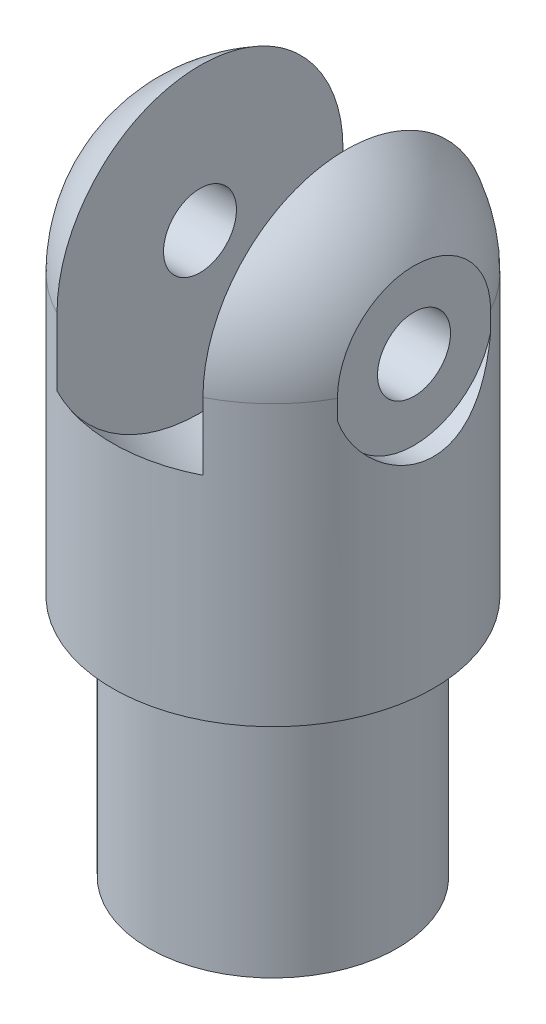
ISO-10303-21;
HEADER;
FILE_DESCRIPTION(('STEP AP214'),'2;1');
FILE_NAME('part.step','',(''),(''),'','','');
FILE_SCHEMA(('AUTOMOTIVE_DESIGN { 1 0 10303 214 1 1 1 1 }'));
ENDSEC;
DATA;
#1=APPLICATION_CONTEXT('core data for automotive mechanical design processes');
#2=APPLICATION_PROTOCOL_DEFINITION('international standard','automotive_design',2000,#1);
#3=PRODUCT_CONTEXT('',#1,'mechanical');
#4=PRODUCT('Part','Part','',(#3));
#5=PRODUCT_RELATED_PRODUCT_CATEGORY('part','',(#4));
#6=PRODUCT_DEFINITION_FORMATION('','',#4);
#7=PRODUCT_DEFINITION_CONTEXT('part definition',#1,'design');
#8=PRODUCT_DEFINITION('design','',#6,#7);
#9=PRODUCT_DEFINITION_SHAPE('','',#8);
#10=(LENGTH_UNIT() NAMED_UNIT(*) SI_UNIT(.MILLI.,.METRE.));
#11=(NAMED_UNIT(*) PLANE_ANGLE_UNIT() SI_UNIT($,.RADIAN.));
#12=(NAMED_UNIT(*) SI_UNIT($,.STERADIAN.) SOLID_ANGLE_UNIT());
#13=UNCERTAINTY_MEASURE_WITH_UNIT(LENGTH_MEASURE(1.E-05),#10,'distance_accuracy_value','');
#14=(GEOMETRIC_REPRESENTATION_CONTEXT(3) GLOBAL_UNCERTAINTY_ASSIGNED_CONTEXT((#13)) GLOBAL_UNIT_ASSIGNED_CONTEXT((#10,
#11,#12)) REPRESENTATION_CONTEXT('',''));
#15=CARTESIAN_POINT('',(0.,0.,0.));
#16=DIRECTION('',(0.,0.,1.));
#17=DIRECTION('',(1.,0.,0.));
#18=AXIS2_PLACEMENT_3D('',#15,#16,#17);
#19=CARTESIAN_POINT('',(0.,54.61,0.));
#20=DIRECTION('',(-1.,0.,0.));
#21=DIRECTION('',(0.,-1.,0.));
#22=AXIS2_PLACEMENT_3D('',#19,#20,#21);
#23=SPHERICAL_SURFACE('',#22,18.183632750361);
#24=CARTESIAN_POINT('',(0.,47.5663642910781,0.));
#25=DIRECTION('',(0.,1.,0.));
#26=DIRECTION('',(0.,0.,1.));
#27=AXIS2_PLACEMENT_3D('',#24,#25,#26);
#28=CIRCLE('',#27,16.764);
#29=CARTESIAN_POINT('',(7.61999999999999,47.5663642910781,-14.9320894720063));
#30=VERTEX_POINT('',#29);
#31=CARTESIAN_POINT('',(-7.62000000000001,47.5663642910781,-14.9320894720063));
#32=VERTEX_POINT('',#31);
#33=EDGE_CURVE('E175',#30,#32,#28,.T.);
#34=ORIENTED_EDGE('',*,*,#33,.T.);
#35=CARTESIAN_POINT('',(-7.62000000000001,54.61,0.));
#36=DIRECTION('',(-1.,0.,0.));
#37=DIRECTION('',(0.,-1.,0.));
#38=AXIS2_PLACEMENT_3D('',#35,#36,#37);
#39=CIRCLE('',#38,16.51);
#40=CARTESIAN_POINT('',(-7.62000000000001,47.5663642910781,14.9320894720063));
#41=VERTEX_POINT('',#40);
#42=EDGE_CURVE('E135',#32,#41,#39,.T.);
#43=ORIENTED_EDGE('',*,*,#42,.T.);
#44=CARTESIAN_POINT('',(7.61999999999999,47.5663642910781,14.9320894720063));
#45=VERTEX_POINT('',#44);
#46=EDGE_CURVE('E165',#41,#45,#28,.T.);
#47=ORIENTED_EDGE('',*,*,#46,.T.);
#48=CARTESIAN_POINT('',(7.61999999999999,54.61,0.));
#49=DIRECTION('',(-1.,0.,0.));
#50=DIRECTION('',(0.,-1.,0.));
#51=AXIS2_PLACEMENT_3D('',#48,#49,#50);
#52=CIRCLE('',#51,16.51);
#53=EDGE_CURVE('E133',#30,#45,#52,.T.);
#54=ORIENTED_EDGE('',*,*,#53,.F.);
#55=EDGE_LOOP('',(#34,#43,#47,#54));
#56=FACE_BOUND('',#55,.T.);
#57=CARTESIAN_POINT('',(0.,36.83,0.));
#58=DIRECTION('',(0.,1.,0.));
#59=DIRECTION('',(0.,0.,1.));
#60=AXIS2_PLACEMENT_3D('',#57,#58,#59);
#61=CIRCLE('',#60,3.81);
#62=CARTESIAN_POINT('',(0.,36.83,3.81));
#63=VERTEX_POINT('',#62);
#64=EDGE_CURVE('E41',#63,#63,#61,.T.);
#65=ORIENTED_EDGE('',*,*,#64,.F.);
#66=EDGE_LOOP('',(#65));
#67=FACE_BOUND('',#66,.T.);
#68=ADVANCED_FACE('F37',(#56,#67),#23,.F.);
#69=CARTESIAN_POINT('',(0.,25.4,0.));
#70=DIRECTION('',(0.,-1.,0.));
#71=DIRECTION('',(0.,0.,-1.));
#72=AXIS2_PLACEMENT_3D('',#69,#70,#71);
#73=CYLINDRICAL_SURFACE('',#72,16.764);
#74=CARTESIAN_POINT('',(0.,25.4,0.));
#75=DIRECTION('',(0.,-1.,0.));
#76=DIRECTION('',(0.,0.,-1.));
#77=AXIS2_PLACEMENT_3D('',#74,#75,#76);
#78=CIRCLE('',#77,16.764);
#79=CARTESIAN_POINT('',(0.,25.4,-16.764));
#80=VERTEX_POINT('',#79);
#81=EDGE_CURVE('E155',#80,#80,#78,.T.);
#82=ORIENTED_EDGE('',*,*,#81,.F.);
#83=EDGE_LOOP('',(#82));
#84=FACE_BOUND('',#83,.T.);
#85=DIRECTION('',(0.,-1.,0.));
#86=VECTOR('',#85,1.);
#87=CARTESIAN_POINT('',(-14.732,25.4,7.99999199999601));
#88=LINE('',#87,#86);
#89=CARTESIAN_POINT('',(-14.732,54.61,7.99999199999601));
#90=VERTEX_POINT('',#89);
#91=CARTESIAN_POINT('',(-14.732,52.5740351181811,7.99999199999601));
#92=VERTEX_POINT('',#91);
#93=EDGE_CURVE('E53',#90,#92,#88,.T.);
#94=ORIENTED_EDGE('',*,*,#93,.T.);
#95=CARTESIAN_POINT('',(-14.732,52.5740351181811,7.99999199999601));
#96=CARTESIAN_POINT('',(-14.7632428149745,52.3476965830814,7.94241358215983));
#97=CARTESIAN_POINT('',(-14.7992408390983,52.1245110768314,7.87536493698056));
#98=CARTESIAN_POINT('',(-14.879188313626,51.6860089675618,7.7232768887593));
#99=CARTESIAN_POINT('',(-14.9231316908732,51.4706865043601,7.63825121839253));
#100=CARTESIAN_POINT('',(-15.0173193540466,51.0497669038307,7.45135367046161));
#101=CARTESIAN_POINT('',(-15.0675440290785,50.8441421273517,7.34953392338282));
#102=CARTESIAN_POINT('',(-15.172784570775,50.4429649693112,7.12973781880574));
#103=CARTESIAN_POINT('',(-15.2278013555183,50.2474145292754,7.01175836291921));
#104=CARTESIAN_POINT('',(-15.3408377940109,49.8679154803039,6.76086247498133));
#105=CARTESIAN_POINT('',(-15.3988485487307,49.6839357301417,6.62798907245145));
#106=CARTESIAN_POINT('',(-15.5164536502358,49.327772245364,6.34779121039099));
#107=CARTESIAN_POINT('',(-15.576048519683,49.1555924727903,6.20046193704372));
#108=CARTESIAN_POINT('',(-15.6953215393529,48.8237713667053,5.89202328109879));
#109=CARTESIAN_POINT('',(-15.7549997161271,48.6641415256538,5.73090154380135));
#110=CARTESIAN_POINT('',(-15.8728994383717,48.3584275593615,5.39576817693688));
#111=CARTESIAN_POINT('',(-15.9311208999466,48.2123442129878,5.22175580724556));
#112=CARTESIAN_POINT('',(-16.0478628509385,47.9268007347405,4.85155017999728));
#113=CARTESIAN_POINT('',(-16.1062164025846,47.7881736847849,4.65466002551564));
#114=CARTESIAN_POINT('',(-16.2180568804278,47.5281591991597,4.24860570896115));
#115=CARTESIAN_POINT('',(-16.271545758772,47.4067648371098,4.03944652625556));
#116=CARTESIAN_POINT('',(-16.3721474970255,47.1823081457725,3.61013350428593));
#117=CARTESIAN_POINT('',(-16.419262715903,47.0792390296274,3.38998377428449));
#118=CARTESIAN_POINT('',(-16.5057477863901,46.8924944270932,2.94014003397476));
#119=CARTESIAN_POINT('',(-16.545118332013,46.8088172028441,2.71044688110508));
#120=CARTESIAN_POINT('',(-16.6128116427845,46.6662899211255,2.25731556721503));
#121=CARTESIAN_POINT('',(-16.6416555412932,46.6062514704973,2.03432900370463));
#122=CARTESIAN_POINT('',(-16.6906167773421,46.5049405685363,1.58318479412133));
#123=CARTESIAN_POINT('',(-16.710734420957,46.463667459004,1.35502732971394));
#124=CARTESIAN_POINT('',(-16.7416457550054,46.4004450568566,0.895538072447056));
#125=CARTESIAN_POINT('',(-16.752444102877,46.3784861116337,0.664207923970718));
#126=CARTESIAN_POINT('',(-16.7644091112563,46.3541622096633,0.200277254742265));
#127=CARTESIAN_POINT('',(-16.7655764400388,46.3517958934271,-0.0323231767470196));
#128=CARTESIAN_POINT('',(-16.7585774682984,46.366015963006,-0.475925150939742));
#129=CARTESIAN_POINT('',(-16.7512374738537,46.3809244339688,-0.686995954489296));
#130=CARTESIAN_POINT('',(-16.7287341668824,46.4268296178267,-1.10696138492671));
#131=CARTESIAN_POINT('',(-16.7135708234283,46.4578263943229,-1.31585600320823));
#132=CARTESIAN_POINT('',(-16.675793299344,46.5355611276885,-1.72998501250147));
#133=CARTESIAN_POINT('',(-16.6531797037887,46.5822978484928,-1.93521968959788));
#134=CARTESIAN_POINT('',(-16.6010418636704,46.6910232478168,-2.34070499905824));
#135=CARTESIAN_POINT('',(-16.5715174082148,46.7530123917843,-2.54095547911748));
#136=CARTESIAN_POINT('',(-16.5061109356301,46.8919173696252,-2.9360224868738));
#137=CARTESIAN_POINT('',(-16.4702050376366,46.9688893797212,-3.13081530542056));
#138=CARTESIAN_POINT('',(-16.3929194386841,47.1369362686502,-3.51311679042385));
#139=CARTESIAN_POINT('',(-16.351538025052,47.2280155615923,-3.70062315393013));
#140=CARTESIAN_POINT('',(-16.2204913759469,47.5213852655865,-4.25078418897572));
#141=CARTESIAN_POINT('',(-16.1238963619702,47.7438638179334,-4.60123949546827));
#142=CARTESIAN_POINT('',(-15.911072723423,48.2589899949749,-5.29262327700378));
#143=CARTESIAN_POINT('',(-15.7938609473103,48.5561316921131,-5.62990125852563));
#144=CARTESIAN_POINT('',(-15.6172315949704,49.0392130610402,-6.09602565455535));
#145=CARTESIAN_POINT('',(-15.5582044904555,49.2065164317534,-6.24480168645752));
#146=CARTESIAN_POINT('',(-15.4413018385372,49.5529525759345,-6.52850608220799));
#147=CARTESIAN_POINT('',(-15.3834263932282,49.7320863921429,-6.66343322272468));
#148=CARTESIAN_POINT('',(-15.2660021267702,50.1155624724044,-6.92845533405345));
#149=CARTESIAN_POINT('',(-15.2066682552839,50.3207834857071,-7.05737592431752));
#150=CARTESIAN_POINT('',(-15.0930610282224,50.7428134689172,-7.2971769897218));
#151=CARTESIAN_POINT('',(-15.0387869161287,50.9596206988409,-7.40806016360994));
#152=CARTESIAN_POINT('',(-14.9370883073101,51.4042571421849,-7.61105063455357));
#153=CARTESIAN_POINT('',(-14.8896848786245,51.6321175119135,-7.70310052277909));
#154=CARTESIAN_POINT('',(-14.803725968713,52.096802057885,-7.8670033936605));
#155=CARTESIAN_POINT('',(-14.7651777545342,52.333633411848,-7.9388397988814));
#156=CARTESIAN_POINT('',(-14.732,52.5740351181811,-7.99999199999601));
#157=B_SPLINE_CURVE_WITH_KNOTS('',3,(#95,#96,#97,#98,#99,#100,#101,#102,#103,#104,#105,#106,
#107,#108,#109,#110,#111,#112,#113,#114,#115,#116,#117,#118,#119,#120,#121,#122,#123,#124,#125,
#126,#127,#128,#129,#130,#131,#132,#133,#134,#135,#136,#137,#138,#139,#140,#141,#142,#143,#144,
#145,#146,#147,#148,#149,#150,#151,#152,#153,#154,#155,#156),.UNSPECIFIED.,.F.,.F.,(4,2,2,2,2,2,
2,2,2,2,2,2,2,2,2,2,2,2,2,2,2,2,2,2,2,2,2,2,2,2,4),(0.,0.706505853907127,1.41247394442979,
2.11629051532641,2.82024222217189,3.52221018258878,4.2244126973953,4.92725093241564,
5.63012955268697,6.37249353165078,7.11455828028311,7.85634762598262,8.59807046836946,
9.29528988206071,9.99248483870203,10.6893311610708,11.3861291304239,12.0205410126832,
12.6549554029508,13.2893199839718,13.9237039258626,14.5605138847824,15.1975235028742,
16.4710365822318,17.8583634398683,18.552385977943,19.2464697693201,19.9940608696873,
20.7415400128165,21.491264794148,22.2416026577729),.UNSPECIFIED.);
#158=CARTESIAN_POINT('',(-14.732,52.5740351181811,-7.99999199999601));
#159=VERTEX_POINT('',#158);
#160=EDGE_CURVE('E11',#92,#159,#157,.T.);
#161=ORIENTED_EDGE('',*,*,#160,.T.);
#162=DIRECTION('',(0.,-1.,0.));
#163=VECTOR('',#162,1.);
#164=CARTESIAN_POINT('',(-14.732,25.4,-7.99999199999601));
#165=LINE('',#164,#163);
#166=CARTESIAN_POINT('',(-14.732,54.61,-7.99999199999601));
#167=VERTEX_POINT('',#166);
#168=EDGE_CURVE('E110',#159,#167,#165,.F.);
#169=ORIENTED_EDGE('',*,*,#168,.T.);
#170=CARTESIAN_POINT('',(0.,54.61,0.));
#171=DIRECTION('',(0.,-1.,0.));
#172=DIRECTION('',(0.,0.,-1.));
#173=AXIS2_PLACEMENT_3D('',#170,#171,#172);
#174=CIRCLE('',#173,16.764);
#175=CARTESIAN_POINT('',(-7.61999999999999,54.61,-14.9320894720063));
#176=VERTEX_POINT('',#175);
#177=EDGE_CURVE('E159',#167,#176,#174,.T.);
#178=ORIENTED_EDGE('',*,*,#177,.T.);
#179=DIRECTION('',(0.,-1.,0.));
#180=VECTOR('',#179,1.);
#181=CARTESIAN_POINT('',(-7.61999999999999,25.4,-14.9320894720063));
#182=LINE('',#181,#180);
#183=EDGE_CURVE('E148',#176,#32,#182,.T.);
#184=ORIENTED_EDGE('',*,*,#183,.T.);
#185=ORIENTED_EDGE('',*,*,#33,.F.);
#186=DIRECTION('',(0.,-1.,0.));
#187=VECTOR('',#186,1.);
#188=CARTESIAN_POINT('',(7.62,25.4,-14.9320894720063));
#189=LINE('',#188,#187);
#190=CARTESIAN_POINT('',(7.61999999999999,54.61,-14.9320894720063));
#191=VERTEX_POINT('',#190);
#192=EDGE_CURVE('E144',#30,#191,#189,.F.);
#193=ORIENTED_EDGE('',*,*,#192,.T.);
#194=CARTESIAN_POINT('',(14.732,54.61,-7.99999199999601));
#195=VERTEX_POINT('',#194);
#196=EDGE_CURVE('E158',#191,#195,#174,.T.);
#197=ORIENTED_EDGE('',*,*,#196,.T.);
#198=DIRECTION('',(0.,-1.,0.));
#199=VECTOR('',#198,1.);
#200=CARTESIAN_POINT('',(14.732,25.4,-7.99999199999601));
#201=LINE('',#200,#199);
#202=CARTESIAN_POINT('',(14.732,52.5740351181811,-7.99999199999601));
#203=VERTEX_POINT('',#202);
#204=EDGE_CURVE('E125',#195,#203,#201,.T.);
#205=ORIENTED_EDGE('',*,*,#204,.T.);
#206=CARTESIAN_POINT('',(14.732,52.5740351181811,7.99999199999601));
#207=CARTESIAN_POINT('',(14.7632428149745,52.3476965830814,7.94241358215983));
#208=CARTESIAN_POINT('',(14.7992408390983,52.1245110768314,7.87536493698056));
#209=CARTESIAN_POINT('',(14.879188313626,51.6860089675618,7.7232768887593));
#210=CARTESIAN_POINT('',(14.9231316908732,51.4706865043601,7.63825121839253));
#211=CARTESIAN_POINT('',(15.0173193540466,51.0497669038307,7.45135367046161));
#212=CARTESIAN_POINT('',(15.0675440290785,50.8441421273517,7.34953392338282));
#213=CARTESIAN_POINT('',(15.172784570775,50.4429649693112,7.12973781880574));
#214=CARTESIAN_POINT('',(15.2278013555183,50.2474145292754,7.01175836291921));
#215=CARTESIAN_POINT('',(15.3408377940109,49.8679154803039,6.76086247498133));
#216=CARTESIAN_POINT('',(15.3988485487307,49.6839357301417,6.62798907245145));
#217=CARTESIAN_POINT('',(15.5164536502358,49.327772245364,6.34779121039099));
#218=CARTESIAN_POINT('',(15.576048519683,49.1555924727903,6.20046193704372));
#219=CARTESIAN_POINT('',(15.6953215393529,48.8237713667053,5.89202328109879));
#220=CARTESIAN_POINT('',(15.7549997161271,48.6641415256538,5.73090154380135));
#221=CARTESIAN_POINT('',(15.8728994383717,48.3584275593615,5.39576817693688));
#222=CARTESIAN_POINT('',(15.9311208999466,48.2123442129878,5.22175580724556));
#223=CARTESIAN_POINT('',(16.0478628509385,47.9268007347405,4.85155017999728));
#224=CARTESIAN_POINT('',(16.1062164025846,47.7881736847849,4.65466002551564));
#225=CARTESIAN_POINT('',(16.2180568804278,47.5281591991597,4.24860570896115));
#226=CARTESIAN_POINT('',(16.271545758772,47.4067648371098,4.03944652625556));
#227=CARTESIAN_POINT('',(16.3721474970255,47.1823081457725,3.61013350428593));
#228=CARTESIAN_POINT('',(16.419262715903,47.0792390296274,3.38998377428449));
#229=CARTESIAN_POINT('',(16.5057477863901,46.8924944270932,2.94014003397476));
#230=CARTESIAN_POINT('',(16.545118332013,46.8088172028441,2.71044688110508));
#231=CARTESIAN_POINT('',(16.6128116427845,46.6662899211255,2.25731556721503));
#232=CARTESIAN_POINT('',(16.6416555412932,46.6062514704973,2.03432900370463));
#233=CARTESIAN_POINT('',(16.6906167773421,46.5049405685363,1.58318479412133));
#234=CARTESIAN_POINT('',(16.710734420957,46.463667459004,1.35502732971394));
#235=CARTESIAN_POINT('',(16.7416457550054,46.4004450568566,0.895538072447056));
#236=CARTESIAN_POINT('',(16.752444102877,46.3784861116337,0.664207923970718));
#237=CARTESIAN_POINT('',(16.7644091112563,46.3541622096633,0.200277254742265));
#238=CARTESIAN_POINT('',(16.7655764400388,46.3517958934271,-0.0323231767470196));
#239=CARTESIAN_POINT('',(16.7585774682984,46.366015963006,-0.475925150939742));
#240=CARTESIAN_POINT('',(16.7512374738537,46.3809244339688,-0.686995954489296));
#241=CARTESIAN_POINT('',(16.7287341668824,46.4268296178267,-1.10696138492671));
#242=CARTESIAN_POINT('',(16.7135708234283,46.4578263943229,-1.31585600320823));
#243=CARTESIAN_POINT('',(16.675793299344,46.5355611276885,-1.72998501250147));
#244=CARTESIAN_POINT('',(16.6531797037887,46.5822978484928,-1.93521968959788));
#245=CARTESIAN_POINT('',(16.6010418636704,46.6910232478168,-2.34070499905824));
#246=CARTESIAN_POINT('',(16.5715174082148,46.7530123917843,-2.54095547911748));
#247=CARTESIAN_POINT('',(16.5061109356301,46.8919173696252,-2.9360224868738));
#248=CARTESIAN_POINT('',(16.4702050376366,46.9688893797212,-3.13081530542056));
#249=CARTESIAN_POINT('',(16.3929194386841,47.1369362686502,-3.51311679042385));
#250=CARTESIAN_POINT('',(16.351538025052,47.2280155615923,-3.70062315393013));
#251=CARTESIAN_POINT('',(16.2204913759469,47.5213852655865,-4.25078418897572));
#252=CARTESIAN_POINT('',(16.1238963619702,47.7438638179334,-4.60123949546827));
#253=CARTESIAN_POINT('',(15.911072723423,48.2589899949749,-5.29262327700378));
#254=CARTESIAN_POINT('',(15.7938609473103,48.5561316921131,-5.62990125852563));
#255=CARTESIAN_POINT('',(15.6172315949704,49.0392130610402,-6.09602565455535));
#256=CARTESIAN_POINT('',(15.5582044904555,49.2065164317534,-6.24480168645752));
#257=CARTESIAN_POINT('',(15.4413018385372,49.5529525759345,-6.52850608220799));
#258=CARTESIAN_POINT('',(15.3834263932282,49.7320863921429,-6.66343322272468));
#259=CARTESIAN_POINT('',(15.2660021267702,50.1155624724044,-6.92845533405345));
#260=CARTESIAN_POINT('',(15.2066682552839,50.3207834857071,-7.05737592431752));
#261=CARTESIAN_POINT('',(15.0930610282224,50.7428134689172,-7.2971769897218));
#262=CARTESIAN_POINT('',(15.0387869161287,50.9596206988409,-7.40806016360994));
#263=CARTESIAN_POINT('',(14.9370883073101,51.4042571421849,-7.61105063455357));
#264=CARTESIAN_POINT('',(14.8896848786245,51.6321175119135,-7.70310052277909));
#265=CARTESIAN_POINT('',(14.803725968713,52.096802057885,-7.8670033936605));
#266=CARTESIAN_POINT('',(14.7651777545342,52.333633411848,-7.9388397988814));
#267=CARTESIAN_POINT('',(14.732,52.5740351181811,-7.99999199999601));
#268=B_SPLINE_CURVE_WITH_KNOTS('',3,(#206,#207,#208,#209,#210,#211,#212,#213,#214,#215,#216,
#217,#218,#219,#220,#221,#222,#223,#224,#225,#226,#227,#228,#229,#230,#231,#232,#233,#234,#235,
#236,#237,#238,#239,#240,#241,#242,#243,#244,#245,#246,#247,#248,#249,#250,#251,#252,#253,#254,
#255,#256,#257,#258,#259,#260,#261,#262,#263,#264,#265,#266,#267),.UNSPECIFIED.,.F.,.F.,(4,2,2,
2,2,2,2,2,2,2,2,2,2,2,2,2,2,2,2,2,2,2,2,2,2,2,2,2,2,2,4),(0.,0.706505853907127,1.41247394442979,
2.11629051532641,2.82024222217189,3.52221018258878,4.2244126973953,4.92725093241564,
5.63012955268697,6.37249353165078,7.11455828028311,7.85634762598262,8.59807046836946,
9.29528988206071,9.99248483870203,10.6893311610708,11.3861291304239,12.0205410126832,
12.6549554029508,13.2893199839718,13.9237039258626,14.5605138847824,15.1975235028742,
16.4710365822318,17.8583634398683,18.552385977943,19.2464697693201,19.9940608696873,
20.7415400128165,21.491264794148,22.2416026577729),.UNSPECIFIED.);
#269=CARTESIAN_POINT('',(14.732,52.5740351181811,7.99999199999601));
#270=VERTEX_POINT('',#269);
#271=EDGE_CURVE('E46',#270,#203,#268,.T.);
#272=ORIENTED_EDGE('',*,*,#271,.F.);
#273=DIRECTION('',(0.,-1.,0.));
#274=VECTOR('',#273,1.);
#275=CARTESIAN_POINT('',(14.732,25.4,7.99999199999601));
#276=LINE('',#275,#274);
#277=CARTESIAN_POINT('',(14.732,54.61,7.99999199999601));
#278=VERTEX_POINT('',#277);
#279=EDGE_CURVE('E130',#270,#278,#276,.F.);
#280=ORIENTED_EDGE('',*,*,#279,.T.);
#281=CARTESIAN_POINT('',(7.62,54.61,14.9320894720063));
#282=VERTEX_POINT('',#281);
#283=EDGE_CURVE('E161',#278,#282,#174,.T.);
#284=ORIENTED_EDGE('',*,*,#283,.T.);
#285=DIRECTION('',(0.,-1.,0.));
#286=VECTOR('',#285,1.);
#287=CARTESIAN_POINT('',(7.62,25.4,14.9320894720063));
#288=LINE('',#287,#286);
#289=EDGE_CURVE('E139',#282,#45,#288,.T.);
#290=ORIENTED_EDGE('',*,*,#289,.T.);
#291=ORIENTED_EDGE('',*,*,#46,.F.);
#292=DIRECTION('',(0.,-1.,0.));
#293=VECTOR('',#292,1.);
#294=CARTESIAN_POINT('',(-7.61999999999999,25.4,14.9320894720063));
#295=LINE('',#294,#293);
#296=CARTESIAN_POINT('',(-7.62,54.61,14.9320894720063));
#297=VERTEX_POINT('',#296);
#298=EDGE_CURVE('E153',#41,#297,#295,.F.);
#299=ORIENTED_EDGE('',*,*,#298,.T.);
#300=EDGE_CURVE('E117',#297,#90,#174,.T.);
#301=ORIENTED_EDGE('',*,*,#300,.T.);
#302=EDGE_LOOP('',(#94,#161,#169,#178,#184,#185,#193,#197,#205,#272,#280,#284,#290,#291,#299,#301));
#303=FACE_BOUND('',#302,.T.);
#304=ADVANCED_FACE('F114',(#84,#303),#73,.T.);
#305=CARTESIAN_POINT('',(0.,54.61,0.));
#306=DIRECTION('',(0.,-1.,0.));
#307=DIRECTION('',(0.,0.,1.));
#308=AXIS2_PLACEMENT_3D('',#305,#306,#307);
#309=SPHERICAL_SURFACE('',#308,16.764);
#310=CARTESIAN_POINT('',(-14.732,54.61,0.));
#311=DIRECTION('',(-1.,0.,0.));
#312=DIRECTION('',(0.,0.,1.));
#313=AXIS2_PLACEMENT_3D('',#310,#311,#312);
#314=CIRCLE('',#313,7.99999199999601);
#315=EDGE_CURVE('E118',#90,#167,#314,.T.);
#316=ORIENTED_EDGE('',*,*,#315,.F.);
#317=ORIENTED_EDGE('',*,*,#300,.F.);
#318=CARTESIAN_POINT('',(-7.62,54.61,0.));
#319=DIRECTION('',(1.,0.,0.));
#320=DIRECTION('',(0.,1.,0.));
#321=AXIS2_PLACEMENT_3D('',#318,#319,#320);
#322=CIRCLE('',#321,14.9320894720063);
#323=EDGE_CURVE('E151',#176,#297,#322,.T.);
#324=ORIENTED_EDGE('',*,*,#323,.F.);
#325=ORIENTED_EDGE('',*,*,#177,.F.);
#326=EDGE_LOOP('',(#316,#317,#324,#325));
#327=FACE_BOUND('',#326,.T.);
#328=ADVANCED_FACE('F210',(#327),#309,.T.);
#329=CARTESIAN_POINT('',(-16.764,54.61,0.));
#330=DIRECTION('',(1.,0.,0.));
#331=DIRECTION('',(0.,0.,-1.));
#332=AXIS2_PLACEMENT_3D('',#329,#330,#331);
#333=CYLINDRICAL_SURFACE('',#332,3.81);
#334=CARTESIAN_POINT('',(-7.62,54.61,0.));
#335=DIRECTION('',(1.,0.,0.));
#336=DIRECTION('',(0.,1.,0.));
#337=AXIS2_PLACEMENT_3D('',#334,#335,#336);
#338=CIRCLE('',#337,3.81);
#339=CARTESIAN_POINT('',(-7.62000000000001,58.42,0.));
#340=VERTEX_POINT('',#339);
#341=EDGE_CURVE('E147',#340,#340,#338,.F.);
#342=ORIENTED_EDGE('',*,*,#341,.F.);
#343=EDGE_LOOP('',(#342));
#344=FACE_BOUND('',#343,.T.);
#345=CARTESIAN_POINT('',(-14.732,54.61,0.));
#346=DIRECTION('',(-1.,0.,0.));
#347=DIRECTION('',(0.,0.,1.));
#348=AXIS2_PLACEMENT_3D('',#345,#346,#347);
#349=CIRCLE('',#348,3.81);
#350=CARTESIAN_POINT('',(-14.732,54.61,3.81));
#351=VERTEX_POINT('',#350);
#352=EDGE_CURVE('E111',#351,#351,#349,.F.);
#353=ORIENTED_EDGE('',*,*,#352,.F.);
#354=EDGE_LOOP('',(#353));
#355=FACE_BOUND('',#354,.T.);
#356=ADVANCED_FACE('F207',(#344,#355),#333,.F.);
#357=CARTESIAN_POINT('',(14.732,54.61,0.));
#358=DIRECTION('',(1.,0.,0.));
#359=DIRECTION('',(0.,0.,-1.));
#360=AXIS2_PLACEMENT_3D('',#357,#358,#359);
#361=CIRCLE('',#360,7.99999199999601);
#362=EDGE_CURVE('E128',#195,#278,#361,.T.);
#363=ORIENTED_EDGE('',*,*,#362,.F.);
#364=ORIENTED_EDGE('',*,*,#196,.F.);
#365=CARTESIAN_POINT('',(7.61999999999999,54.61,0.));
#366=DIRECTION('',(-1.,0.,0.));
#367=DIRECTION('',(0.,-1.,0.));
#368=AXIS2_PLACEMENT_3D('',#365,#366,#367);
#369=CIRCLE('',#368,14.9320894720063);
#370=EDGE_CURVE('E142',#282,#191,#369,.T.);
#371=ORIENTED_EDGE('',*,*,#370,.F.);
#372=ORIENTED_EDGE('',*,*,#283,.F.);
#373=EDGE_LOOP('',(#363,#364,#371,#372));
#374=FACE_BOUND('',#373,.T.);
#375=ADVANCED_FACE('F209',(#374),#309,.T.);
#376=CARTESIAN_POINT('',(7.61999999999999,54.61,0.));
#377=DIRECTION('',(-1.,0.,0.));
#378=DIRECTION('',(0.,-1.,0.));
#379=AXIS2_PLACEMENT_3D('',#376,#377,#378);
#380=CIRCLE('',#379,3.81);
#381=CARTESIAN_POINT('',(7.61999999999999,50.8,0.));
#382=VERTEX_POINT('',#381);
#383=EDGE_CURVE('E138',#382,#382,#380,.F.);
#384=ORIENTED_EDGE('',*,*,#383,.F.);
#385=EDGE_LOOP('',(#384));
#386=FACE_BOUND('',#385,.T.);
#387=CARTESIAN_POINT('',(14.732,54.61,0.));
#388=DIRECTION('',(1.,0.,0.));
#389=DIRECTION('',(0.,0.,-1.));
#390=AXIS2_PLACEMENT_3D('',#387,#388,#389);
#391=CIRCLE('',#390,3.81);
#392=CARTESIAN_POINT('',(14.732,54.61,-3.81));
#393=VERTEX_POINT('',#392);
#394=EDGE_CURVE('E124',#393,#393,#391,.F.);
#395=ORIENTED_EDGE('',*,*,#394,.F.);
#396=EDGE_LOOP('',(#395));
#397=FACE_BOUND('',#396,.T.);
#398=ADVANCED_FACE('F212',(#386,#397),#333,.F.);
#399=CARTESIAN_POINT('',(0.,25.4,0.));
#400=DIRECTION('',(0.,-1.,0.));
#401=DIRECTION('',(0.,0.,-1.));
#402=AXIS2_PLACEMENT_3D('',#399,#400,#401);
#403=CYLINDRICAL_SURFACE('',#402,12.9794);
#404=CARTESIAN_POINT('',(0.,25.4,0.));
#405=DIRECTION('',(0.,1.,0.));
#406=DIRECTION('',(0.,0.,1.));
#407=AXIS2_PLACEMENT_3D('',#404,#405,#406);
#408=CIRCLE('',#407,12.9794);
#409=CARTESIAN_POINT('',(0.,25.4,12.9794));
#410=VERTEX_POINT('',#409);
#411=EDGE_CURVE('E162',#410,#410,#408,.T.);
#412=ORIENTED_EDGE('',*,*,#411,.F.);
#413=EDGE_LOOP('',(#412));
#414=FACE_BOUND('',#413,.T.);
#415=CARTESIAN_POINT('',(0.,0.,0.));
#416=DIRECTION('',(0.,1.,0.));
#417=DIRECTION('',(0.,0.,1.));
#418=AXIS2_PLACEMENT_3D('',#415,#416,#417);
#419=CIRCLE('',#418,12.9794);
#420=CARTESIAN_POINT('',(0.,0.,12.9794));
#421=VERTEX_POINT('',#420);
#422=EDGE_CURVE('E166',#421,#421,#419,.T.);
#423=ORIENTED_EDGE('',*,*,#422,.T.);
#424=EDGE_LOOP('',(#423));
#425=FACE_BOUND('',#424,.T.);
#426=ADVANCED_FACE('F39',(#414,#425),#403,.T.);
#427=CARTESIAN_POINT('',(0.,0.,0.));
#428=DIRECTION('',(0.,1.,0.));
#429=DIRECTION('',(0.,0.,1.));
#430=AXIS2_PLACEMENT_3D('',#427,#428,#429);
#431=PLANE('',#430);
#432=CARTESIAN_POINT('',(0.,0.,0.));
#433=DIRECTION('',(0.,1.,0.));
#434=DIRECTION('',(0.,0.,1.));
#435=AXIS2_PLACEMENT_3D('',#432,#433,#434);
#436=CIRCLE('',#435,1.905);
#437=CARTESIAN_POINT('',(0.,0.,1.905));
#438=VERTEX_POINT('',#437);
#439=EDGE_CURVE('E358',#438,#438,#436,.T.);
#440=ORIENTED_EDGE('',*,*,#439,.T.);
#441=EDGE_LOOP('',(#440));
#442=FACE_BOUND('',#441,.T.);
#443=ORIENTED_EDGE('',*,*,#422,.F.);
#444=EDGE_LOOP('',(#443));
#445=FACE_BOUND('',#444,.T.);
#446=ADVANCED_FACE('F226',(#442,#445),#431,.F.);
#447=CARTESIAN_POINT('',(0.,25.4,0.));
#448=DIRECTION('',(0.,-1.,0.));
#449=DIRECTION('',(0.,0.,-1.));
#450=AXIS2_PLACEMENT_3D('',#447,#448,#449);
#451=PLANE('',#450);
#452=ORIENTED_EDGE('',*,*,#411,.T.);
#453=EDGE_LOOP('',(#452));
#454=FACE_BOUND('',#453,.T.);
#455=ORIENTED_EDGE('',*,*,#81,.T.);
#456=EDGE_LOOP('',(#455));
#457=FACE_BOUND('',#456,.T.);
#458=ADVANCED_FACE('F205',(#454,#457),#451,.T.);
#459=CARTESIAN_POINT('',(-7.62,38.1,0.));
#460=DIRECTION('',(1.,0.,0.));
#461=DIRECTION('',(0.,1.,0.));
#462=AXIS2_PLACEMENT_3D('',#459,#460,#461);
#463=PLANE('',#462);
#464=ORIENTED_EDGE('',*,*,#42,.F.);
#465=ORIENTED_EDGE('',*,*,#183,.F.);
#466=ORIENTED_EDGE('',*,*,#323,.T.);
#467=ORIENTED_EDGE('',*,*,#298,.F.);
#468=EDGE_LOOP('',(#464,#465,#466,#467));
#469=FACE_BOUND('',#468,.T.);
#470=ORIENTED_EDGE('',*,*,#341,.T.);
#471=EDGE_LOOP('',(#470));
#472=FACE_BOUND('',#471,.T.);
#473=ADVANCED_FACE('F199',(#469,#472),#463,.T.);
#474=CARTESIAN_POINT('',(7.61999999999999,54.61,0.));
#475=DIRECTION('',(-1.,0.,0.));
#476=DIRECTION('',(0.,-1.,0.));
#477=AXIS2_PLACEMENT_3D('',#474,#475,#476);
#478=PLANE('',#477);
#479=ORIENTED_EDGE('',*,*,#53,.T.);
#480=ORIENTED_EDGE('',*,*,#289,.F.);
#481=ORIENTED_EDGE('',*,*,#370,.T.);
#482=ORIENTED_EDGE('',*,*,#192,.F.);
#483=EDGE_LOOP('',(#479,#480,#481,#482));
#484=FACE_BOUND('',#483,.T.);
#485=ORIENTED_EDGE('',*,*,#383,.T.);
#486=EDGE_LOOP('',(#485));
#487=FACE_BOUND('',#486,.T.);
#488=ADVANCED_FACE('F196',(#484,#487),#478,.T.);
#489=CARTESIAN_POINT('',(14.732,54.61,0.));
#490=DIRECTION('',(1.,0.,0.));
#491=DIRECTION('',(0.,0.,-1.));
#492=AXIS2_PLACEMENT_3D('',#489,#490,#491);
#493=PLANE('',#492);
#494=CARTESIAN_POINT('',(14.732,54.61,0.));
#495=DIRECTION('',(1.,0.,0.));
#496=DIRECTION('',(0.,0.,-1.));
#497=AXIS2_PLACEMENT_3D('',#494,#495,#496);
#498=CIRCLE('',#497,8.255);
#499=EDGE_CURVE('E61',#270,#203,#498,.T.);
#500=ORIENTED_EDGE('',*,*,#499,.T.);
#501=ORIENTED_EDGE('',*,*,#204,.F.);
#502=ORIENTED_EDGE('',*,*,#362,.T.);
#503=ORIENTED_EDGE('',*,*,#279,.F.);
#504=EDGE_LOOP('',(#500,#501,#502,#503));
#505=FACE_BOUND('',#504,.T.);
#506=ORIENTED_EDGE('',*,*,#394,.T.);
#507=EDGE_LOOP('',(#506));
#508=FACE_BOUND('',#507,.T.);
#509=ADVANCED_FACE('F193',(#505,#508),#493,.T.);
#510=CARTESIAN_POINT('',(14.732,54.61,0.));
#511=DIRECTION('',(1.,0.,0.));
#512=DIRECTION('',(0.,0.,-1.));
#513=AXIS2_PLACEMENT_3D('',#510,#511,#512);
#514=CYLINDRICAL_SURFACE('',#513,8.255);
#515=ORIENTED_EDGE('',*,*,#499,.F.);
#516=ORIENTED_EDGE('',*,*,#271,.T.);
#517=EDGE_LOOP('',(#515,#516));
#518=FACE_BOUND('',#517,.T.);
#519=ADVANCED_FACE('F188',(#518),#514,.F.);
#520=CARTESIAN_POINT('',(-14.732,54.61,0.));
#521=DIRECTION('',(-1.,0.,0.));
#522=DIRECTION('',(0.,0.,-1.));
#523=AXIS2_PLACEMENT_3D('',#520,#521,#522);
#524=PLANE('',#523);
#525=CARTESIAN_POINT('',(-14.732,54.61,0.));
#526=DIRECTION('',(1.,0.,0.));
#527=DIRECTION('',(0.,0.,-1.));
#528=AXIS2_PLACEMENT_3D('',#525,#526,#527);
#529=CIRCLE('',#528,8.255);
#530=EDGE_CURVE('E105',#92,#159,#529,.T.);
#531=ORIENTED_EDGE('',*,*,#530,.F.);
#532=ORIENTED_EDGE('',*,*,#93,.F.);
#533=ORIENTED_EDGE('',*,*,#315,.T.);
#534=ORIENTED_EDGE('',*,*,#168,.F.);
#535=EDGE_LOOP('',(#531,#532,#533,#534));
#536=FACE_BOUND('',#535,.T.);
#537=ORIENTED_EDGE('',*,*,#352,.T.);
#538=EDGE_LOOP('',(#537));
#539=FACE_BOUND('',#538,.T.);
#540=ADVANCED_FACE('F108',(#536,#539),#524,.T.);
#541=CARTESIAN_POINT('',(-14.732,54.61,0.));
#542=DIRECTION('',(-1.,0.,0.));
#543=DIRECTION('',(0.,0.,1.));
#544=AXIS2_PLACEMENT_3D('',#541,#542,#543);
#545=CYLINDRICAL_SURFACE('',#544,8.255);
#546=ORIENTED_EDGE('',*,*,#530,.T.);
#547=ORIENTED_EDGE('',*,*,#160,.F.);
#548=EDGE_LOOP('',(#546,#547));
#549=FACE_BOUND('',#548,.T.);
#550=ADVANCED_FACE('F104',(#549),#545,.F.);
#551=CARTESIAN_POINT('',(0.,57.15,0.));
#552=DIRECTION('',(0.,-1.,0.));
#553=DIRECTION('',(0.,0.,-1.));
#554=AXIS2_PLACEMENT_3D('',#551,#552,#553);
#555=CYLINDRICAL_SURFACE('',#554,3.81);
#556=CARTESIAN_POINT('',(0.,30.48,0.));
#557=DIRECTION('',(0.,1.,0.));
#558=DIRECTION('',(0.,0.,1.));
#559=AXIS2_PLACEMENT_3D('',#556,#557,#558);
#560=CIRCLE('',#559,3.81);
#561=CARTESIAN_POINT('',(0.,30.48,3.81));
#562=VERTEX_POINT('',#561);
#563=EDGE_CURVE('E361',#562,#562,#560,.T.);
#564=ORIENTED_EDGE('',*,*,#563,.F.);
#565=EDGE_LOOP('',(#564));
#566=FACE_BOUND('',#565,.T.);
#567=ORIENTED_EDGE('',*,*,#64,.T.);
#568=EDGE_LOOP('',(#567));
#569=FACE_BOUND('',#568,.T.);
#570=ADVANCED_FACE('F254',(#566,#569),#555,.F.);
#571=CARTESIAN_POINT('',(0.,30.48,0.));
#572=DIRECTION('',(0.,1.,0.));
#573=DIRECTION('',(0.,0.,1.));
#574=AXIS2_PLACEMENT_3D('',#571,#572,#573);
#575=PLANE('',#574);
#576=CARTESIAN_POINT('',(0.,30.48,0.));
#577=DIRECTION('',(0.,1.,0.));
#578=DIRECTION('',(0.,0.,1.));
#579=AXIS2_PLACEMENT_3D('',#576,#577,#578);
#580=CIRCLE('',#579,1.905);
#581=CARTESIAN_POINT('',(0.,30.48,1.905));
#582=VERTEX_POINT('',#581);
#583=EDGE_CURVE('E362',#582,#582,#580,.T.);
#584=ORIENTED_EDGE('',*,*,#583,.F.);
#585=EDGE_LOOP('',(#584));
#586=FACE_BOUND('',#585,.T.);
#587=ORIENTED_EDGE('',*,*,#563,.T.);
#588=EDGE_LOOP('',(#587));
#589=FACE_BOUND('',#588,.T.);
#590=ADVANCED_FACE('F261',(#586,#589),#575,.T.);
#591=CARTESIAN_POINT('',(0.,0.,0.));
#592=DIRECTION('',(0.,1.,0.));
#593=DIRECTION('',(0.,0.,1.));
#594=AXIS2_PLACEMENT_3D('',#591,#592,#593);
#595=CYLINDRICAL_SURFACE('',#594,1.905);
#596=ORIENTED_EDGE('',*,*,#439,.F.);
#597=EDGE_LOOP('',(#596));
#598=FACE_BOUND('',#597,.T.);
#599=ORIENTED_EDGE('',*,*,#583,.T.);
#600=EDGE_LOOP('',(#599));
#601=FACE_BOUND('',#600,.T.);
#602=ADVANCED_FACE('F270',(#598,#601),#595,.F.);
#603=CLOSED_SHELL('',(#68,#304,#328,#356,#375,#398,#426,#446,#458,#473,#488,#509,#519,#540,#550,
#570,#590,#602));
#604=MANIFOLD_SOLID_BREP('B2',#603);
#605=ADVANCED_BREP_SHAPE_REPRESENTATION('',(#18,#604),#14);
#606=SHAPE_DEFINITION_REPRESENTATION(#9,#605);
ENDSEC;
END-ISO-10303-21;
